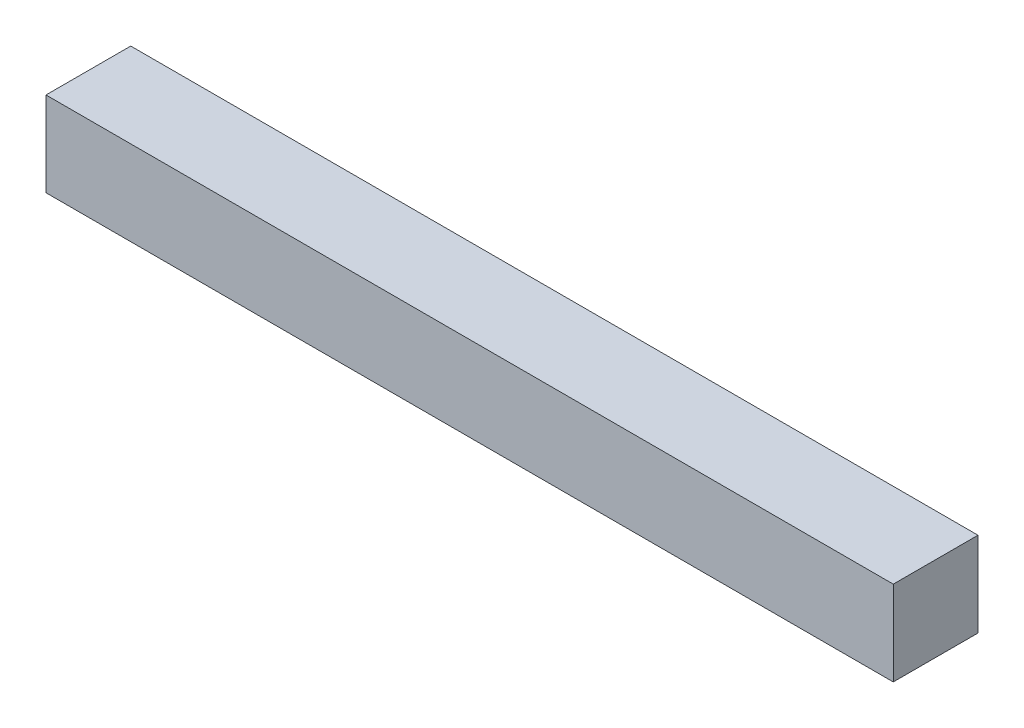
ISO-10303-21;
HEADER;
FILE_DESCRIPTION(('STEP AP214'),'2;1');
FILE_NAME('part.step','',(''),(''),'','','');
FILE_SCHEMA(('AUTOMOTIVE_DESIGN { 1 0 10303 214 1 1 1 1 }'));
ENDSEC;
DATA;
#1=APPLICATION_CONTEXT('core data for automotive mechanical design processes');
#2=APPLICATION_PROTOCOL_DEFINITION('international standard','automotive_design',2000,#1);
#3=PRODUCT_CONTEXT('',#1,'mechanical');
#4=PRODUCT('Part','Part','',(#3));
#5=PRODUCT_RELATED_PRODUCT_CATEGORY('part','',(#4));
#6=PRODUCT_DEFINITION_FORMATION('','',#4);
#7=PRODUCT_DEFINITION_CONTEXT('part definition',#1,'design');
#8=PRODUCT_DEFINITION('design','',#6,#7);
#9=PRODUCT_DEFINITION_SHAPE('','',#8);
#10=(LENGTH_UNIT() NAMED_UNIT(*) SI_UNIT(.MILLI.,.METRE.));
#11=(NAMED_UNIT(*) PLANE_ANGLE_UNIT() SI_UNIT($,.RADIAN.));
#12=(NAMED_UNIT(*) SI_UNIT($,.STERADIAN.) SOLID_ANGLE_UNIT());
#13=UNCERTAINTY_MEASURE_WITH_UNIT(LENGTH_MEASURE(1.E-05),#10,'distance_accuracy_value','');
#14=(GEOMETRIC_REPRESENTATION_CONTEXT(3) GLOBAL_UNCERTAINTY_ASSIGNED_CONTEXT((#13)) GLOBAL_UNIT_ASSIGNED_CONTEXT((#10,
#11,#12)) REPRESENTATION_CONTEXT('',''));
#15=CARTESIAN_POINT('',(0.,0.,0.));
#16=DIRECTION('',(0.,0.,1.));
#17=DIRECTION('',(1.,0.,0.));
#18=AXIS2_PLACEMENT_3D('',#15,#16,#17);
#19=CARTESIAN_POINT('',(0.,0.,1.));
#20=DIRECTION('',(1.,0.,0.));
#21=DIRECTION('',(0.,1.,0.));
#22=AXIS2_PLACEMENT_3D('',#19,#20,#21);
#23=PLANE('',#22);
#24=DIRECTION('',(0.,-1.,0.));
#25=VECTOR('',#24,1.);
#26=CARTESIAN_POINT('',(0.,0.,0.));
#27=LINE('',#26,#25);
#28=CARTESIAN_POINT('',(0.,1.,0.));
#29=VERTEX_POINT('',#28);
#30=CARTESIAN_POINT('',(0.,0.,0.));
#31=VERTEX_POINT('',#30);
#32=EDGE_CURVE('E100',#29,#31,#27,.T.);
#33=ORIENTED_EDGE('',*,*,#32,.T.);
#34=DIRECTION('',(0.,0.,-1.));
#35=VECTOR('',#34,1.);
#36=CARTESIAN_POINT('',(0.,0.,1.));
#37=LINE('',#36,#35);
#38=CARTESIAN_POINT('',(0.,0.,1.));
#39=VERTEX_POINT('',#38);
#40=EDGE_CURVE('E11',#39,#31,#37,.T.);
#41=ORIENTED_EDGE('',*,*,#40,.F.);
#42=DIRECTION('',(0.,-1.,0.));
#43=VECTOR('',#42,1.);
#44=CARTESIAN_POINT('',(0.,0.,1.));
#45=LINE('',#44,#43);
#46=CARTESIAN_POINT('',(0.,1.,1.));
#47=VERTEX_POINT('',#46);
#48=EDGE_CURVE('E88',#47,#39,#45,.T.);
#49=ORIENTED_EDGE('',*,*,#48,.F.);
#50=DIRECTION('',(0.,0.,-1.));
#51=VECTOR('',#50,1.);
#52=CARTESIAN_POINT('',(0.,1.,1.));
#53=LINE('',#52,#51);
#54=EDGE_CURVE('E96',#47,#29,#53,.T.);
#55=ORIENTED_EDGE('',*,*,#54,.T.);
#56=EDGE_LOOP('',(#33,#41,#49,#55));
#57=FACE_BOUND('',#56,.T.);
#58=ADVANCED_FACE('F37',(#57),#23,.F.);
#59=CARTESIAN_POINT('',(0.,0.,1.));
#60=DIRECTION('',(0.,1.,0.));
#61=DIRECTION('',(0.,0.,1.));
#62=AXIS2_PLACEMENT_3D('',#59,#60,#61);
#63=PLANE('',#62);
#64=DIRECTION('',(1.,0.,0.));
#65=VECTOR('',#64,1.);
#66=CARTESIAN_POINT('',(0.,0.,0.));
#67=LINE('',#66,#65);
#68=CARTESIAN_POINT('',(10.,0.,0.));
#69=VERTEX_POINT('',#68);
#70=EDGE_CURVE('E92',#31,#69,#67,.T.);
#71=ORIENTED_EDGE('',*,*,#70,.T.);
#72=DIRECTION('',(0.,0.,-1.));
#73=VECTOR('',#72,1.);
#74=CARTESIAN_POINT('',(10.,0.,1.));
#75=LINE('',#74,#73);
#76=CARTESIAN_POINT('',(10.,0.,1.));
#77=VERTEX_POINT('',#76);
#78=EDGE_CURVE('E45',#77,#69,#75,.T.);
#79=ORIENTED_EDGE('',*,*,#78,.F.);
#80=DIRECTION('',(1.,0.,0.));
#81=VECTOR('',#80,1.);
#82=CARTESIAN_POINT('',(0.,0.,1.));
#83=LINE('',#82,#81);
#84=EDGE_CURVE('E83',#39,#77,#83,.T.);
#85=ORIENTED_EDGE('',*,*,#84,.F.);
#86=ORIENTED_EDGE('',*,*,#40,.T.);
#87=EDGE_LOOP('',(#71,#79,#85,#86));
#88=FACE_BOUND('',#87,.T.);
#89=ADVANCED_FACE('F91',(#88),#63,.F.);
#90=CARTESIAN_POINT('',(10.,0.,1.));
#91=DIRECTION('',(-1.,0.,0.));
#92=DIRECTION('',(0.,-1.,0.));
#93=AXIS2_PLACEMENT_3D('',#90,#91,#92);
#94=PLANE('',#93);
#95=DIRECTION('',(0.,1.,0.));
#96=VECTOR('',#95,1.);
#97=CARTESIAN_POINT('',(10.,0.,0.));
#98=LINE('',#97,#96);
#99=CARTESIAN_POINT('',(10.,1.,0.));
#100=VERTEX_POINT('',#99);
#101=EDGE_CURVE('E70',#69,#100,#98,.T.);
#102=ORIENTED_EDGE('',*,*,#101,.T.);
#103=DIRECTION('',(0.,0.,-1.));
#104=VECTOR('',#103,1.);
#105=CARTESIAN_POINT('',(10.,1.,1.));
#106=LINE('',#105,#104);
#107=CARTESIAN_POINT('',(10.,1.,1.));
#108=VERTEX_POINT('',#107);
#109=EDGE_CURVE('E93',#108,#100,#106,.T.);
#110=ORIENTED_EDGE('',*,*,#109,.F.);
#111=DIRECTION('',(0.,1.,0.));
#112=VECTOR('',#111,1.);
#113=CARTESIAN_POINT('',(10.,0.,1.));
#114=LINE('',#113,#112);
#115=EDGE_CURVE('E86',#77,#108,#114,.T.);
#116=ORIENTED_EDGE('',*,*,#115,.F.);
#117=ORIENTED_EDGE('',*,*,#78,.T.);
#118=EDGE_LOOP('',(#102,#110,#116,#117));
#119=FACE_BOUND('',#118,.T.);
#120=ADVANCED_FACE('F94',(#119),#94,.F.);
#121=CARTESIAN_POINT('',(0.,1.,1.));
#122=DIRECTION('',(0.,-1.,0.));
#123=DIRECTION('',(1.,0.,0.));
#124=AXIS2_PLACEMENT_3D('',#121,#122,#123);
#125=PLANE('',#124);
#126=DIRECTION('',(-1.,0.,0.));
#127=VECTOR('',#126,1.);
#128=CARTESIAN_POINT('',(0.,1.,0.));
#129=LINE('',#128,#127);
#130=EDGE_CURVE('E76',#100,#29,#129,.T.);
#131=ORIENTED_EDGE('',*,*,#130,.T.);
#132=ORIENTED_EDGE('',*,*,#54,.F.);
#133=DIRECTION('',(-1.,0.,0.));
#134=VECTOR('',#133,1.);
#135=CARTESIAN_POINT('',(0.,1.,1.));
#136=LINE('',#135,#134);
#137=EDGE_CURVE('E53',#108,#47,#136,.T.);
#138=ORIENTED_EDGE('',*,*,#137,.F.);
#139=ORIENTED_EDGE('',*,*,#109,.T.);
#140=EDGE_LOOP('',(#131,#132,#138,#139));
#141=FACE_BOUND('',#140,.T.);
#142=ADVANCED_FACE('F107',(#141),#125,.F.);
#143=CARTESIAN_POINT('',(0.,1.,1.));
#144=DIRECTION('',(0.,0.,-1.));
#145=DIRECTION('',(-1.,0.,0.));
#146=AXIS2_PLACEMENT_3D('',#143,#144,#145);
#147=PLANE('',#146);
#148=ORIENTED_EDGE('',*,*,#48,.T.);
#149=ORIENTED_EDGE('',*,*,#84,.T.);
#150=ORIENTED_EDGE('',*,*,#115,.T.);
#151=ORIENTED_EDGE('',*,*,#137,.T.);
#152=EDGE_LOOP('',(#148,#149,#150,#151));
#153=FACE_BOUND('',#152,.T.);
#154=ADVANCED_FACE('F84',(#153),#147,.F.);
#155=CARTESIAN_POINT('',(0.,1.,0.));
#156=DIRECTION('',(0.,0.,-1.));
#157=DIRECTION('',(-1.,0.,0.));
#158=AXIS2_PLACEMENT_3D('',#155,#156,#157);
#159=PLANE('',#158);
#160=ORIENTED_EDGE('',*,*,#32,.F.);
#161=ORIENTED_EDGE('',*,*,#130,.F.);
#162=ORIENTED_EDGE('',*,*,#101,.F.);
#163=ORIENTED_EDGE('',*,*,#70,.F.);
#164=EDGE_LOOP('',(#160,#161,#162,#163));
#165=FACE_BOUND('',#164,.T.);
#166=ADVANCED_FACE('F110',(#165),#159,.T.);
#167=CLOSED_SHELL('',(#58,#89,#120,#142,#154,#166));
#168=MANIFOLD_SOLID_BREP('B2',#167);
#169=ADVANCED_BREP_SHAPE_REPRESENTATION('',(#18,#168),#14);
#170=SHAPE_DEFINITION_REPRESENTATION(#9,#169);
ENDSEC;
END-ISO-10303-21;
